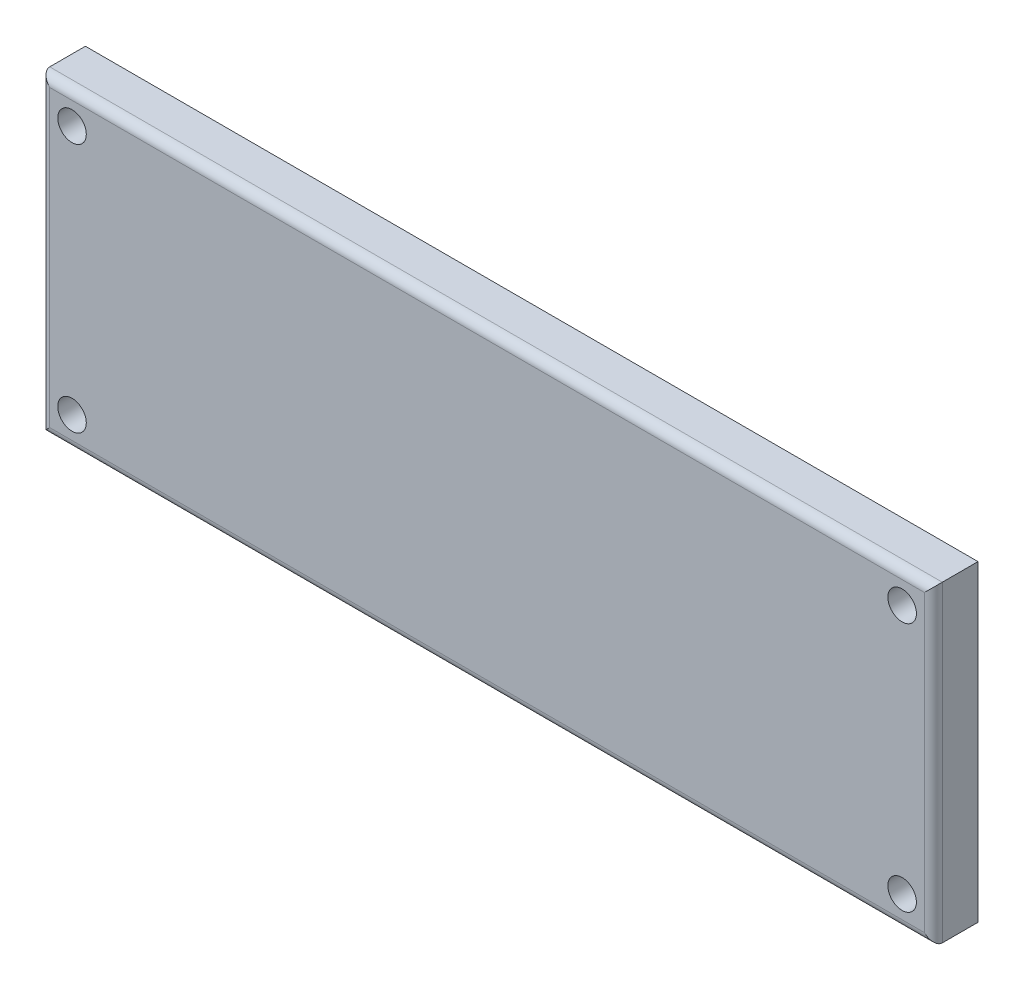
ISO-10303-21;
HEADER;
FILE_DESCRIPTION(('STEP AP214'),'2;1');
FILE_NAME('part.step','',(''),(''),'','','');
FILE_SCHEMA(('AUTOMOTIVE_DESIGN { 1 0 10303 214 1 1 1 1 }'));
ENDSEC;
DATA;
#1=APPLICATION_CONTEXT('core data for automotive mechanical design processes');
#2=APPLICATION_PROTOCOL_DEFINITION('international standard','automotive_design',2000,#1);
#3=PRODUCT_CONTEXT('',#1,'mechanical');
#4=PRODUCT('Part','Part','',(#3));
#5=PRODUCT_RELATED_PRODUCT_CATEGORY('part','',(#4));
#6=PRODUCT_DEFINITION_FORMATION('','',#4);
#7=PRODUCT_DEFINITION_CONTEXT('part definition',#1,'design');
#8=PRODUCT_DEFINITION('design','',#6,#7);
#9=PRODUCT_DEFINITION_SHAPE('','',#8);
#10=(LENGTH_UNIT() NAMED_UNIT(*) SI_UNIT(.MILLI.,.METRE.));
#11=(NAMED_UNIT(*) PLANE_ANGLE_UNIT() SI_UNIT($,.RADIAN.));
#12=(NAMED_UNIT(*) SI_UNIT($,.STERADIAN.) SOLID_ANGLE_UNIT());
#13=UNCERTAINTY_MEASURE_WITH_UNIT(LENGTH_MEASURE(1.E-05),#10,'distance_accuracy_value','');
#14=(GEOMETRIC_REPRESENTATION_CONTEXT(3) GLOBAL_UNCERTAINTY_ASSIGNED_CONTEXT((#13)) GLOBAL_UNIT_ASSIGNED_CONTEXT((#10,
#11,#12)) REPRESENTATION_CONTEXT('',''));
#15=CARTESIAN_POINT('',(0.,0.,0.));
#16=DIRECTION('',(0.,0.,1.));
#17=DIRECTION('',(1.,0.,0.));
#18=AXIS2_PLACEMENT_3D('',#15,#16,#17);
#19=CARTESIAN_POINT('',(-50.,17.5,5.));
#20=DIRECTION('',(1.,0.,0.));
#21=DIRECTION('',(0.,0.,-1.));
#22=AXIS2_PLACEMENT_3D('',#19,#20,#21);
#23=PLANE('',#22);
#24=DIRECTION('',(0.,0.,-1.));
#25=VECTOR('',#24,1.);
#26=CARTESIAN_POINT('',(-50.,-17.5,5.));
#27=LINE('',#26,#25);
#28=CARTESIAN_POINT('',(-50.,-17.5,4.));
#29=VERTEX_POINT('',#28);
#30=CARTESIAN_POINT('',(-50.,-17.5,0.));
#31=VERTEX_POINT('',#30);
#32=EDGE_CURVE('E89',#29,#31,#27,.T.);
#33=ORIENTED_EDGE('',*,*,#32,.F.);
#34=DIRECTION('',(0.,-1.,0.));
#35=VECTOR('',#34,1.);
#36=CARTESIAN_POINT('',(-50.,17.5,4.));
#37=LINE('',#36,#35);
#38=CARTESIAN_POINT('',(-50.,17.5,4.));
#39=VERTEX_POINT('',#38);
#40=EDGE_CURVE('E46',#29,#39,#37,.F.);
#41=ORIENTED_EDGE('',*,*,#40,.T.);
#42=DIRECTION('',(0.,0.,-1.));
#43=VECTOR('',#42,1.);
#44=CARTESIAN_POINT('',(-50.,17.5,5.));
#45=LINE('',#44,#43);
#46=CARTESIAN_POINT('',(-50.,17.5,0.));
#47=VERTEX_POINT('',#46);
#48=EDGE_CURVE('E106',#39,#47,#45,.T.);
#49=ORIENTED_EDGE('',*,*,#48,.T.);
#50=DIRECTION('',(0.,-1.,0.));
#51=VECTOR('',#50,1.);
#52=CARTESIAN_POINT('',(-50.,17.5,0.));
#53=LINE('',#52,#51);
#54=EDGE_CURVE('E102',#47,#31,#53,.T.);
#55=ORIENTED_EDGE('',*,*,#54,.T.);
#56=EDGE_LOOP('',(#33,#41,#49,#55));
#57=FACE_BOUND('',#56,.T.);
#58=ADVANCED_FACE('F37',(#57),#23,.F.);
#59=CARTESIAN_POINT('',(50.0000000000001,-17.5,5.));
#60=DIRECTION('',(0.,1.,0.));
#61=DIRECTION('',(-1.,0.,0.));
#62=AXIS2_PLACEMENT_3D('',#59,#60,#61);
#63=PLANE('',#62);
#64=DIRECTION('',(0.,0.,-1.));
#65=VECTOR('',#64,1.);
#66=CARTESIAN_POINT('',(50.0000000000001,-17.5,5.));
#67=LINE('',#66,#65);
#68=CARTESIAN_POINT('',(50.0000000000001,-17.5,4.));
#69=VERTEX_POINT('',#68);
#70=CARTESIAN_POINT('',(50.0000000000001,-17.5,0.));
#71=VERTEX_POINT('',#70);
#72=EDGE_CURVE('E96',#69,#71,#67,.T.);
#73=ORIENTED_EDGE('',*,*,#72,.F.);
#74=DIRECTION('',(1.,0.,0.));
#75=VECTOR('',#74,1.);
#76=CARTESIAN_POINT('',(50.0000000000001,-17.5,4.));
#77=LINE('',#76,#75);
#78=EDGE_CURVE('E61',#69,#29,#77,.F.);
#79=ORIENTED_EDGE('',*,*,#78,.T.);
#80=ORIENTED_EDGE('',*,*,#32,.T.);
#81=DIRECTION('',(1.,0.,0.));
#82=VECTOR('',#81,1.);
#83=CARTESIAN_POINT('',(50.0000000000001,-17.5,0.));
#84=LINE('',#83,#82);
#85=EDGE_CURVE('E92',#31,#71,#84,.T.);
#86=ORIENTED_EDGE('',*,*,#85,.T.);
#87=EDGE_LOOP('',(#73,#79,#80,#86));
#88=FACE_BOUND('',#87,.T.);
#89=ADVANCED_FACE('F91',(#88),#63,.F.);
#90=CARTESIAN_POINT('',(50.,17.5,5.));
#91=DIRECTION('',(-1.,0.,0.));
#92=DIRECTION('',(0.,-1.,0.));
#93=AXIS2_PLACEMENT_3D('',#90,#91,#92);
#94=PLANE('',#93);
#95=DIRECTION('',(0.,0.,-1.));
#96=VECTOR('',#95,1.);
#97=CARTESIAN_POINT('',(50.,17.5,5.));
#98=LINE('',#97,#96);
#99=CARTESIAN_POINT('',(50.,17.5,4.));
#100=VERTEX_POINT('',#99);
#101=CARTESIAN_POINT('',(50.,17.5,0.));
#102=VERTEX_POINT('',#101);
#103=EDGE_CURVE('E119',#100,#102,#98,.T.);
#104=ORIENTED_EDGE('',*,*,#103,.F.);
#105=DIRECTION('',(0.,1.,0.));
#106=VECTOR('',#105,1.);
#107=CARTESIAN_POINT('',(50.,17.5,4.));
#108=LINE('',#107,#106);
#109=EDGE_CURVE('E130',#100,#69,#108,.F.);
#110=ORIENTED_EDGE('',*,*,#109,.T.);
#111=ORIENTED_EDGE('',*,*,#72,.T.);
#112=DIRECTION('',(0.,1.,0.));
#113=VECTOR('',#112,1.);
#114=CARTESIAN_POINT('',(50.,17.5,0.));
#115=LINE('',#114,#113);
#116=EDGE_CURVE('E104',#71,#102,#115,.T.);
#117=ORIENTED_EDGE('',*,*,#116,.T.);
#118=EDGE_LOOP('',(#104,#110,#111,#117));
#119=FACE_BOUND('',#118,.T.);
#120=ADVANCED_FACE('F208',(#119),#94,.F.);
#121=CARTESIAN_POINT('',(50.,17.5,5.));
#122=DIRECTION('',(0.,-1.,0.));
#123=DIRECTION('',(1.,0.,0.));
#124=AXIS2_PLACEMENT_3D('',#121,#122,#123);
#125=PLANE('',#124);
#126=ORIENTED_EDGE('',*,*,#48,.F.);
#127=DIRECTION('',(-1.,0.,0.));
#128=VECTOR('',#127,1.);
#129=CARTESIAN_POINT('',(50.,17.5,4.));
#130=LINE('',#129,#128);
#131=EDGE_CURVE('E11',#39,#100,#130,.F.);
#132=ORIENTED_EDGE('',*,*,#131,.T.);
#133=ORIENTED_EDGE('',*,*,#103,.T.);
#134=DIRECTION('',(-1.,0.,0.));
#135=VECTOR('',#134,1.);
#136=CARTESIAN_POINT('',(50.,17.5,0.));
#137=LINE('',#136,#135);
#138=EDGE_CURVE('E116',#102,#47,#137,.T.);
#139=ORIENTED_EDGE('',*,*,#138,.T.);
#140=EDGE_LOOP('',(#126,#132,#133,#139));
#141=FACE_BOUND('',#140,.T.);
#142=ADVANCED_FACE('F182',(#141),#125,.F.);
#143=CARTESIAN_POINT('',(0.,0.,5.));
#144=DIRECTION('',(0.,0.,-1.));
#145=DIRECTION('',(-1.,0.,0.));
#146=AXIS2_PLACEMENT_3D('',#143,#144,#145);
#147=PLANE('',#146);
#148=DIRECTION('',(1.,0.,0.));
#149=VECTOR('',#148,1.);
#150=CARTESIAN_POINT('',(0.,-16.5,5.));
#151=LINE('',#150,#149);
#152=CARTESIAN_POINT('',(-49.,-16.5,5.));
#153=VERTEX_POINT('',#152);
#154=CARTESIAN_POINT('',(49.0000000000001,-16.5,5.));
#155=VERTEX_POINT('',#154);
#156=EDGE_CURVE('E125',#153,#155,#151,.T.);
#157=ORIENTED_EDGE('',*,*,#156,.T.);
#158=DIRECTION('',(0.,1.,0.));
#159=VECTOR('',#158,1.);
#160=CARTESIAN_POINT('',(49.,1.55431223447522E-13,5.));
#161=LINE('',#160,#159);
#162=CARTESIAN_POINT('',(49.,16.5,5.));
#163=VERTEX_POINT('',#162);
#164=EDGE_CURVE('E127',#155,#163,#161,.T.);
#165=ORIENTED_EDGE('',*,*,#164,.T.);
#166=DIRECTION('',(-1.,0.,0.));
#167=VECTOR('',#166,1.);
#168=CARTESIAN_POINT('',(0.,16.5,5.));
#169=LINE('',#168,#167);
#170=CARTESIAN_POINT('',(-49.,16.5,5.));
#171=VERTEX_POINT('',#170);
#172=EDGE_CURVE('E95',#163,#171,#169,.T.);
#173=ORIENTED_EDGE('',*,*,#172,.T.);
#174=DIRECTION('',(0.,-1.,0.));
#175=VECTOR('',#174,1.);
#176=CARTESIAN_POINT('',(-49.,0.,5.));
#177=LINE('',#176,#175);
#178=EDGE_CURVE('E123',#171,#153,#177,.T.);
#179=ORIENTED_EDGE('',*,*,#178,.T.);
#180=EDGE_LOOP('',(#157,#165,#173,#179));
#181=FACE_BOUND('',#180,.T.);
#182=CARTESIAN_POINT('',(-46.5,-14.,5.));
#183=DIRECTION('',(0.,0.,1.));
#184=DIRECTION('',(1.,0.,0.));
#185=AXIS2_PLACEMENT_3D('',#182,#183,#184);
#186=CIRCLE('',#185,1.6);
#187=CARTESIAN_POINT('',(-44.9,-14.,5.));
#188=VERTEX_POINT('',#187);
#189=EDGE_CURVE('E158',#188,#188,#186,.T.);
#190=ORIENTED_EDGE('',*,*,#189,.F.);
#191=EDGE_LOOP('',(#190));
#192=FACE_BOUND('',#191,.T.);
#193=CARTESIAN_POINT('',(46.5000000000001,14.,5.));
#194=DIRECTION('',(0.,0.,1.));
#195=DIRECTION('',(1.,0.,0.));
#196=AXIS2_PLACEMENT_3D('',#193,#194,#195);
#197=CIRCLE('',#196,1.6);
#198=CARTESIAN_POINT('',(48.1000000000001,14.,5.));
#199=VERTEX_POINT('',#198);
#200=EDGE_CURVE('E164',#199,#199,#197,.T.);
#201=ORIENTED_EDGE('',*,*,#200,.F.);
#202=EDGE_LOOP('',(#201));
#203=FACE_BOUND('',#202,.T.);
#204=CARTESIAN_POINT('',(46.5000000000001,-14.,5.));
#205=DIRECTION('',(0.,0.,1.));
#206=DIRECTION('',(1.,0.,0.));
#207=AXIS2_PLACEMENT_3D('',#204,#205,#206);
#208=CIRCLE('',#207,1.6);
#209=CARTESIAN_POINT('',(48.1000000000001,-14.,5.));
#210=VERTEX_POINT('',#209);
#211=EDGE_CURVE('E150',#210,#210,#208,.T.);
#212=ORIENTED_EDGE('',*,*,#211,.F.);
#213=EDGE_LOOP('',(#212));
#214=FACE_BOUND('',#213,.T.);
#215=CARTESIAN_POINT('',(-46.5,14.,5.));
#216=DIRECTION('',(0.,0.,1.));
#217=DIRECTION('',(1.,0.,0.));
#218=AXIS2_PLACEMENT_3D('',#215,#216,#217);
#219=CIRCLE('',#218,1.6);
#220=CARTESIAN_POINT('',(-44.9,14.,5.));
#221=VERTEX_POINT('',#220);
#222=EDGE_CURVE('E111',#221,#221,#219,.T.);
#223=ORIENTED_EDGE('',*,*,#222,.F.);
#224=EDGE_LOOP('',(#223));
#225=FACE_BOUND('',#224,.T.);
#226=ADVANCED_FACE('F179',(#181,#192,#203,#214,#225),#147,.F.);
#227=CARTESIAN_POINT('',(0.,0.,0.));
#228=DIRECTION('',(0.,0.,-1.));
#229=DIRECTION('',(-1.,0.,0.));
#230=AXIS2_PLACEMENT_3D('',#227,#228,#229);
#231=PLANE('',#230);
#232=CARTESIAN_POINT('',(-46.5,-14.,0.));
#233=DIRECTION('',(0.,0.,1.));
#234=DIRECTION('',(1.,0.,0.));
#235=AXIS2_PLACEMENT_3D('',#232,#233,#234);
#236=CIRCLE('',#235,1.6);
#237=CARTESIAN_POINT('',(-44.9,-14.,0.));
#238=VERTEX_POINT('',#237);
#239=EDGE_CURVE('E161',#238,#238,#236,.T.);
#240=ORIENTED_EDGE('',*,*,#239,.T.);
#241=EDGE_LOOP('',(#240));
#242=FACE_BOUND('',#241,.T.);
#243=CARTESIAN_POINT('',(46.5000000000001,14.,0.));
#244=DIRECTION('',(0.,0.,1.));
#245=DIRECTION('',(1.,0.,0.));
#246=AXIS2_PLACEMENT_3D('',#243,#244,#245);
#247=CIRCLE('',#246,1.6);
#248=CARTESIAN_POINT('',(48.1000000000001,14.,0.));
#249=VERTEX_POINT('',#248);
#250=EDGE_CURVE('E155',#249,#249,#247,.T.);
#251=ORIENTED_EDGE('',*,*,#250,.T.);
#252=EDGE_LOOP('',(#251));
#253=FACE_BOUND('',#252,.T.);
#254=CARTESIAN_POINT('',(46.5000000000001,-14.,0.));
#255=DIRECTION('',(0.,0.,1.));
#256=DIRECTION('',(1.,0.,0.));
#257=AXIS2_PLACEMENT_3D('',#254,#255,#256);
#258=CIRCLE('',#257,1.6);
#259=CARTESIAN_POINT('',(48.1000000000001,-14.,0.));
#260=VERTEX_POINT('',#259);
#261=EDGE_CURVE('E145',#260,#260,#258,.T.);
#262=ORIENTED_EDGE('',*,*,#261,.T.);
#263=EDGE_LOOP('',(#262));
#264=FACE_BOUND('',#263,.T.);
#265=CARTESIAN_POINT('',(-46.5,14.,0.));
#266=DIRECTION('',(0.,0.,1.));
#267=DIRECTION('',(1.,0.,0.));
#268=AXIS2_PLACEMENT_3D('',#265,#266,#267);
#269=CIRCLE('',#268,1.6);
#270=CARTESIAN_POINT('',(-44.9,14.,0.));
#271=VERTEX_POINT('',#270);
#272=EDGE_CURVE('E108',#271,#271,#269,.T.);
#273=ORIENTED_EDGE('',*,*,#272,.T.);
#274=EDGE_LOOP('',(#273));
#275=FACE_BOUND('',#274,.T.);
#276=ORIENTED_EDGE('',*,*,#54,.F.);
#277=ORIENTED_EDGE('',*,*,#138,.F.);
#278=ORIENTED_EDGE('',*,*,#116,.F.);
#279=ORIENTED_EDGE('',*,*,#85,.F.);
#280=EDGE_LOOP('',(#276,#277,#278,#279));
#281=FACE_BOUND('',#280,.T.);
#282=ADVANCED_FACE('F100',(#242,#253,#264,#275,#281),#231,.T.);
#283=CARTESIAN_POINT('',(-46.5,14.,0.));
#284=DIRECTION('',(0.,0.,1.));
#285=DIRECTION('',(1.,0.,0.));
#286=AXIS2_PLACEMENT_3D('',#283,#284,#285);
#287=CYLINDRICAL_SURFACE('',#286,1.6);
#288=ORIENTED_EDGE('',*,*,#272,.F.);
#289=EDGE_LOOP('',(#288));
#290=FACE_BOUND('',#289,.T.);
#291=ORIENTED_EDGE('',*,*,#222,.T.);
#292=EDGE_LOOP('',(#291));
#293=FACE_BOUND('',#292,.T.);
#294=ADVANCED_FACE('F190',(#290,#293),#287,.F.);
#295=CARTESIAN_POINT('',(46.5000000000001,-14.,0.));
#296=DIRECTION('',(0.,0.,1.));
#297=DIRECTION('',(1.,0.,0.));
#298=AXIS2_PLACEMENT_3D('',#295,#296,#297);
#299=CYLINDRICAL_SURFACE('',#298,1.6);
#300=ORIENTED_EDGE('',*,*,#261,.F.);
#301=EDGE_LOOP('',(#300));
#302=FACE_BOUND('',#301,.T.);
#303=ORIENTED_EDGE('',*,*,#211,.T.);
#304=EDGE_LOOP('',(#303));
#305=FACE_BOUND('',#304,.T.);
#306=ADVANCED_FACE('F175',(#302,#305),#299,.F.);
#307=CARTESIAN_POINT('',(46.5000000000001,14.,0.));
#308=DIRECTION('',(0.,0.,1.));
#309=DIRECTION('',(1.,0.,0.));
#310=AXIS2_PLACEMENT_3D('',#307,#308,#309);
#311=CYLINDRICAL_SURFACE('',#310,1.6);
#312=ORIENTED_EDGE('',*,*,#250,.F.);
#313=EDGE_LOOP('',(#312));
#314=FACE_BOUND('',#313,.T.);
#315=ORIENTED_EDGE('',*,*,#200,.T.);
#316=EDGE_LOOP('',(#315));
#317=FACE_BOUND('',#316,.T.);
#318=ADVANCED_FACE('F171',(#314,#317),#311,.F.);
#319=CARTESIAN_POINT('',(-46.5,-14.,0.));
#320=DIRECTION('',(0.,0.,1.));
#321=DIRECTION('',(1.,0.,0.));
#322=AXIS2_PLACEMENT_3D('',#319,#320,#321);
#323=CYLINDRICAL_SURFACE('',#322,1.6);
#324=ORIENTED_EDGE('',*,*,#239,.F.);
#325=EDGE_LOOP('',(#324));
#326=FACE_BOUND('',#325,.T.);
#327=ORIENTED_EDGE('',*,*,#189,.T.);
#328=EDGE_LOOP('',(#327));
#329=FACE_BOUND('',#328,.T.);
#330=ADVANCED_FACE('F174',(#326,#329),#323,.F.);
#331=CARTESIAN_POINT('',(-49.,0.,4.));
#332=DIRECTION('',(0.,-1.,0.));
#333=DIRECTION('',(0.,0.,-1.));
#334=AXIS2_PLACEMENT_3D('',#331,#332,#333);
#335=CYLINDRICAL_SURFACE('',#334,1.);
#336=CARTESIAN_POINT('',(-49.,16.5,4.));
#337=DIRECTION('',(-0.707106781186547,-0.707106781186548,0.));
#338=DIRECTION('',(-0.707106781186548,0.707106781186547,0.));
#339=AXIS2_PLACEMENT_3D('',#336,#337,#338);
#340=ELLIPSE('',#339,1.41421356237309,1.);
#341=EDGE_CURVE('E138',#39,#171,#340,.F.);
#342=ORIENTED_EDGE('',*,*,#341,.F.);
#343=ORIENTED_EDGE('',*,*,#40,.F.);
#344=CARTESIAN_POINT('',(-49.,-16.5,4.));
#345=DIRECTION('',(0.707106781186548,-0.707106781186547,0.));
#346=DIRECTION('',(-0.707106781186547,-0.707106781186547,0.));
#347=AXIS2_PLACEMENT_3D('',#344,#345,#346);
#348=ELLIPSE('',#347,1.4142135623731,1.);
#349=EDGE_CURVE('E41',#153,#29,#348,.T.);
#350=ORIENTED_EDGE('',*,*,#349,.F.);
#351=ORIENTED_EDGE('',*,*,#178,.F.);
#352=EDGE_LOOP('',(#342,#343,#350,#351));
#353=FACE_BOUND('',#352,.T.);
#354=ADVANCED_FACE('F39',(#353),#335,.T.);
#355=CARTESIAN_POINT('',(0.,-16.5,4.));
#356=DIRECTION('',(1.,0.,0.));
#357=DIRECTION('',(0.,1.,0.));
#358=AXIS2_PLACEMENT_3D('',#355,#356,#357);
#359=CYLINDRICAL_SURFACE('',#358,1.);
#360=ORIENTED_EDGE('',*,*,#349,.T.);
#361=ORIENTED_EDGE('',*,*,#78,.F.);
#362=CARTESIAN_POINT('',(49.0000000000001,-16.5,4.));
#363=DIRECTION('',(0.707106781186546,0.707106781186549,0.));
#364=DIRECTION('',(0.707106781186549,-0.707106781186546,0.));
#365=AXIS2_PLACEMENT_3D('',#362,#363,#364);
#366=ELLIPSE('',#365,1.4142135623731,1.);
#367=EDGE_CURVE('E137',#155,#69,#366,.T.);
#368=ORIENTED_EDGE('',*,*,#367,.F.);
#369=ORIENTED_EDGE('',*,*,#156,.F.);
#370=EDGE_LOOP('',(#360,#361,#368,#369));
#371=FACE_BOUND('',#370,.T.);
#372=ADVANCED_FACE('F218',(#371),#359,.T.);
#373=CARTESIAN_POINT('',(0.,16.5,4.));
#374=DIRECTION('',(-1.,0.,0.));
#375=DIRECTION('',(0.,-1.,0.));
#376=AXIS2_PLACEMENT_3D('',#373,#374,#375);
#377=CYLINDRICAL_SURFACE('',#376,1.);
#378=ORIENTED_EDGE('',*,*,#341,.T.);
#379=ORIENTED_EDGE('',*,*,#172,.F.);
#380=CARTESIAN_POINT('',(49.,16.5,4.));
#381=DIRECTION('',(-0.707106781186549,0.707106781186546,0.));
#382=DIRECTION('',(-0.707106781186546,-0.707106781186549,0.));
#383=AXIS2_PLACEMENT_3D('',#380,#381,#382);
#384=ELLIPSE('',#383,1.41421356237309,1.);
#385=EDGE_CURVE('E135',#100,#163,#384,.F.);
#386=ORIENTED_EDGE('',*,*,#385,.F.);
#387=ORIENTED_EDGE('',*,*,#131,.F.);
#388=EDGE_LOOP('',(#378,#379,#386,#387));
#389=FACE_BOUND('',#388,.T.);
#390=ADVANCED_FACE('F215',(#389),#377,.T.);
#391=CARTESIAN_POINT('',(49.,1.55431223447522E-13,4.));
#392=DIRECTION('',(0.,1.,0.));
#393=DIRECTION('',(-1.,0.,0.));
#394=AXIS2_PLACEMENT_3D('',#391,#392,#393);
#395=CYLINDRICAL_SURFACE('',#394,1.);
#396=ORIENTED_EDGE('',*,*,#367,.T.);
#397=ORIENTED_EDGE('',*,*,#109,.F.);
#398=ORIENTED_EDGE('',*,*,#385,.T.);
#399=ORIENTED_EDGE('',*,*,#164,.F.);
#400=EDGE_LOOP('',(#396,#397,#398,#399));
#401=FACE_BOUND('',#400,.T.);
#402=ADVANCED_FACE('F212',(#401),#395,.T.);
#403=CLOSED_SHELL('',(#58,#89,#120,#142,#226,#282,#294,#306,#318,#330,#354,#372,#390,#402));
#404=MANIFOLD_SOLID_BREP('B2',#403);
#405=ADVANCED_BREP_SHAPE_REPRESENTATION('',(#18,#404),#14);
#406=SHAPE_DEFINITION_REPRESENTATION(#9,#405);
ENDSEC;
END-ISO-10303-21;
